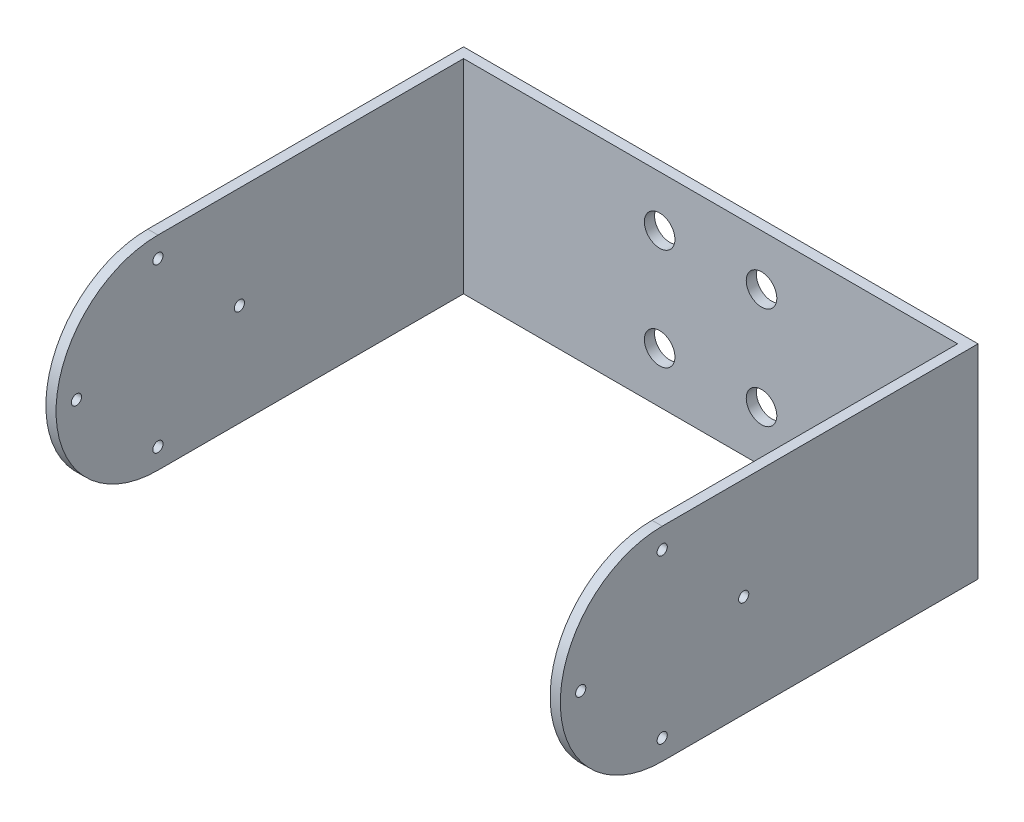
ISO-10303-21;
HEADER;
FILE_DESCRIPTION(('STEP AP214'),'2;1');
FILE_NAME('part.step','',(''),(''),'','','');
FILE_SCHEMA(('AUTOMOTIVE_DESIGN { 1 0 10303 214 1 1 1 1 }'));
ENDSEC;
DATA;
#1=APPLICATION_CONTEXT('core data for automotive mechanical design processes');
#2=APPLICATION_PROTOCOL_DEFINITION('international standard','automotive_design',2000,#1);
#3=PRODUCT_CONTEXT('',#1,'mechanical');
#4=PRODUCT('Part','Part','',(#3));
#5=PRODUCT_RELATED_PRODUCT_CATEGORY('part','',(#4));
#6=PRODUCT_DEFINITION_FORMATION('','',#4);
#7=PRODUCT_DEFINITION_CONTEXT('part definition',#1,'design');
#8=PRODUCT_DEFINITION('design','',#6,#7);
#9=PRODUCT_DEFINITION_SHAPE('','',#8);
#10=(LENGTH_UNIT() NAMED_UNIT(*) SI_UNIT(.MILLI.,.METRE.));
#11=(NAMED_UNIT(*) PLANE_ANGLE_UNIT() SI_UNIT($,.RADIAN.));
#12=(NAMED_UNIT(*) SI_UNIT($,.STERADIAN.) SOLID_ANGLE_UNIT());
#13=UNCERTAINTY_MEASURE_WITH_UNIT(LENGTH_MEASURE(1.E-05),#10,'distance_accuracy_value','');
#14=(GEOMETRIC_REPRESENTATION_CONTEXT(3) GLOBAL_UNCERTAINTY_ASSIGNED_CONTEXT((#13)) GLOBAL_UNIT_ASSIGNED_CONTEXT((#10,
#11,#12)) REPRESENTATION_CONTEXT('',''));
#15=CARTESIAN_POINT('',(0.,0.,0.));
#16=DIRECTION('',(0.,0.,1.));
#17=DIRECTION('',(1.,0.,0.));
#18=AXIS2_PLACEMENT_3D('',#15,#16,#17);
#19=CARTESIAN_POINT('',(-25.25,10.,1.));
#20=DIRECTION('',(1.,0.,0.));
#21=DIRECTION('',(0.,1.,0.));
#22=AXIS2_PLACEMENT_3D('',#19,#20,#21);
#23=PLANE('',#22);
#24=CARTESIAN_POINT('',(-25.25,8.00000000000001,31.));
#25=DIRECTION('',(1.,0.,0.));
#26=DIRECTION('',(0.,0.,-1.));
#27=AXIS2_PLACEMENT_3D('',#24,#25,#26);
#28=CIRCLE('',#27,0.5);
#29=CARTESIAN_POINT('',(-25.25,8.00000000000001,30.5));
#30=VERTEX_POINT('',#29);
#31=EDGE_CURVE('E162',#30,#30,#28,.T.);
#32=ORIENTED_EDGE('',*,*,#31,.T.);
#33=EDGE_LOOP('',(#32));
#34=FACE_BOUND('',#33,.T.);
#35=CARTESIAN_POINT('',(-25.25,0.,23.));
#36=DIRECTION('',(1.,0.,0.));
#37=DIRECTION('',(0.,0.,-1.));
#38=AXIS2_PLACEMENT_3D('',#35,#36,#37);
#39=CIRCLE('',#38,0.499999999999998);
#40=CARTESIAN_POINT('',(-25.25,0.,22.5));
#41=VERTEX_POINT('',#40);
#42=EDGE_CURVE('E258',#41,#41,#39,.T.);
#43=ORIENTED_EDGE('',*,*,#42,.T.);
#44=EDGE_LOOP('',(#43));
#45=FACE_BOUND('',#44,.T.);
#46=CARTESIAN_POINT('',(-25.25,-7.99999999999999,31.0000000000001));
#47=DIRECTION('',(1.,0.,0.));
#48=DIRECTION('',(0.,0.,-1.));
#49=AXIS2_PLACEMENT_3D('',#46,#47,#48);
#50=CIRCLE('',#49,0.499999999999996);
#51=CARTESIAN_POINT('',(-25.25,-7.99999999999999,30.5000000000001));
#52=VERTEX_POINT('',#51);
#53=EDGE_CURVE('E262',#52,#52,#50,.T.);
#54=ORIENTED_EDGE('',*,*,#53,.T.);
#55=EDGE_LOOP('',(#54));
#56=FACE_BOUND('',#55,.T.);
#57=CARTESIAN_POINT('',(-25.25,0.,39.));
#58=DIRECTION('',(1.,0.,0.));
#59=DIRECTION('',(0.,0.,-1.));
#60=AXIS2_PLACEMENT_3D('',#57,#58,#59);
#61=CIRCLE('',#60,0.499999999999999);
#62=CARTESIAN_POINT('',(-25.25,0.,38.5));
#63=VERTEX_POINT('',#62);
#64=EDGE_CURVE('E158',#63,#63,#61,.T.);
#65=ORIENTED_EDGE('',*,*,#64,.T.);
#66=EDGE_LOOP('',(#65));
#67=FACE_BOUND('',#66,.T.);
#68=CARTESIAN_POINT('',(-25.25,0.,31.));
#69=DIRECTION('',(-1.,0.,0.));
#70=DIRECTION('',(0.,-1.,0.));
#71=AXIS2_PLACEMENT_3D('',#68,#69,#70);
#72=CIRCLE('',#71,10.);
#73=CARTESIAN_POINT('',(-25.25,-10.,31.));
#74=VERTEX_POINT('',#73);
#75=CARTESIAN_POINT('',(-25.25,10.,31.));
#76=VERTEX_POINT('',#75);
#77=EDGE_CURVE('E119',#74,#76,#72,.T.);
#78=ORIENTED_EDGE('',*,*,#77,.T.);
#79=DIRECTION('',(0.,0.,-1.));
#80=VECTOR('',#79,1.);
#81=CARTESIAN_POINT('',(-25.25,10.,1.));
#82=LINE('',#81,#80);
#83=CARTESIAN_POINT('',(-25.25,10.,0.));
#84=VERTEX_POINT('',#83);
#85=EDGE_CURVE('E123',#76,#84,#82,.T.);
#86=ORIENTED_EDGE('',*,*,#85,.T.);
#87=DIRECTION('',(0.,-1.,0.));
#88=VECTOR('',#87,1.);
#89=CARTESIAN_POINT('',(-25.25,10.,0.));
#90=LINE('',#89,#88);
#91=CARTESIAN_POINT('',(-25.25,-10.,0.));
#92=VERTEX_POINT('',#91);
#93=EDGE_CURVE('E206',#84,#92,#90,.T.);
#94=ORIENTED_EDGE('',*,*,#93,.T.);
#95=DIRECTION('',(0.,0.,-1.));
#96=VECTOR('',#95,1.);
#97=CARTESIAN_POINT('',(-25.25,-10.,1.));
#98=LINE('',#97,#96);
#99=EDGE_CURVE('E12',#74,#92,#98,.T.);
#100=ORIENTED_EDGE('',*,*,#99,.F.);
#101=EDGE_LOOP('',(#78,#86,#94,#100));
#102=FACE_BOUND('',#101,.T.);
#103=ADVANCED_FACE('F52',(#34,#45,#56,#67,#102),#23,.F.);
#104=CARTESIAN_POINT('',(25.25,10.,1.));
#105=DIRECTION('',(-1.,0.,0.));
#106=DIRECTION('',(0.,-1.,0.));
#107=AXIS2_PLACEMENT_3D('',#104,#105,#106);
#108=PLANE('',#107);
#109=CARTESIAN_POINT('',(25.25,8.00000000000001,31.));
#110=DIRECTION('',(1.,0.,0.));
#111=DIRECTION('',(0.,0.,-1.));
#112=AXIS2_PLACEMENT_3D('',#109,#110,#111);
#113=CIRCLE('',#112,0.5);
#114=CARTESIAN_POINT('',(25.25,8.00000000000001,30.5));
#115=VERTEX_POINT('',#114);
#116=EDGE_CURVE('E502',#115,#115,#113,.T.);
#117=ORIENTED_EDGE('',*,*,#116,.F.);
#118=EDGE_LOOP('',(#117));
#119=FACE_BOUND('',#118,.T.);
#120=CARTESIAN_POINT('',(25.25,0.,23.));
#121=DIRECTION('',(1.,0.,0.));
#122=DIRECTION('',(0.,0.,-1.));
#123=AXIS2_PLACEMENT_3D('',#120,#121,#122);
#124=CIRCLE('',#123,0.499999999999998);
#125=CARTESIAN_POINT('',(25.25,0.,22.5));
#126=VERTEX_POINT('',#125);
#127=EDGE_CURVE('E488',#126,#126,#124,.T.);
#128=ORIENTED_EDGE('',*,*,#127,.F.);
#129=EDGE_LOOP('',(#128));
#130=FACE_BOUND('',#129,.T.);
#131=CARTESIAN_POINT('',(25.25,-7.99999999999999,31.0000000000001));
#132=DIRECTION('',(1.,0.,0.));
#133=DIRECTION('',(0.,0.,-1.));
#134=AXIS2_PLACEMENT_3D('',#131,#132,#133);
#135=CIRCLE('',#134,0.499999999999996);
#136=CARTESIAN_POINT('',(25.25,-7.99999999999999,30.5000000000001));
#137=VERTEX_POINT('',#136);
#138=EDGE_CURVE('E175',#137,#137,#135,.T.);
#139=ORIENTED_EDGE('',*,*,#138,.F.);
#140=EDGE_LOOP('',(#139));
#141=FACE_BOUND('',#140,.T.);
#142=CARTESIAN_POINT('',(25.25,0.,39.));
#143=DIRECTION('',(1.,0.,0.));
#144=DIRECTION('',(0.,0.,-1.));
#145=AXIS2_PLACEMENT_3D('',#142,#143,#144);
#146=CIRCLE('',#145,0.499999999999999);
#147=CARTESIAN_POINT('',(25.25,0.,38.5));
#148=VERTEX_POINT('',#147);
#149=EDGE_CURVE('E181',#148,#148,#146,.T.);
#150=ORIENTED_EDGE('',*,*,#149,.F.);
#151=EDGE_LOOP('',(#150));
#152=FACE_BOUND('',#151,.T.);
#153=DIRECTION('',(0.,0.,-1.));
#154=VECTOR('',#153,1.);
#155=CARTESIAN_POINT('',(25.25,10.,1.));
#156=LINE('',#155,#154);
#157=CARTESIAN_POINT('',(25.25,10.,31.));
#158=VERTEX_POINT('',#157);
#159=CARTESIAN_POINT('',(25.25,10.,0.));
#160=VERTEX_POINT('',#159);
#161=EDGE_CURVE('E144',#158,#160,#156,.T.);
#162=ORIENTED_EDGE('',*,*,#161,.F.);
#163=CARTESIAN_POINT('',(25.25,0.,31.));
#164=DIRECTION('',(-1.,0.,0.));
#165=DIRECTION('',(0.,-1.,0.));
#166=AXIS2_PLACEMENT_3D('',#163,#164,#165);
#167=CIRCLE('',#166,10.);
#168=CARTESIAN_POINT('',(25.25,-9.99999999999999,31.));
#169=VERTEX_POINT('',#168);
#170=EDGE_CURVE('E193',#169,#158,#167,.T.);
#171=ORIENTED_EDGE('',*,*,#170,.F.);
#172=DIRECTION('',(0.,0.,-1.));
#173=VECTOR('',#172,1.);
#174=CARTESIAN_POINT('',(25.25,-10.,1.));
#175=LINE('',#174,#173);
#176=CARTESIAN_POINT('',(25.25,-10.,0.));
#177=VERTEX_POINT('',#176);
#178=EDGE_CURVE('E60',#169,#177,#175,.T.);
#179=ORIENTED_EDGE('',*,*,#178,.T.);
#180=DIRECTION('',(0.,1.,0.));
#181=VECTOR('',#180,1.);
#182=CARTESIAN_POINT('',(25.25,10.,0.));
#183=LINE('',#182,#181);
#184=EDGE_CURVE('E211',#177,#160,#183,.T.);
#185=ORIENTED_EDGE('',*,*,#184,.T.);
#186=EDGE_LOOP('',(#162,#171,#179,#185));
#187=FACE_BOUND('',#186,.T.);
#188=ADVANCED_FACE('F216',(#119,#130,#141,#152,#187),#108,.F.);
#189=CARTESIAN_POINT('',(-24.25,10.,41.));
#190=DIRECTION('',(-1.,0.,0.));
#191=DIRECTION('',(0.,-1.,0.));
#192=AXIS2_PLACEMENT_3D('',#189,#190,#191);
#193=PLANE('',#192);
#194=CARTESIAN_POINT('',(-24.25,8.00000000000001,31.));
#195=DIRECTION('',(-1.,0.,0.));
#196=DIRECTION('',(0.,-1.,0.));
#197=AXIS2_PLACEMENT_3D('',#194,#195,#196);
#198=CIRCLE('',#197,0.5);
#199=CARTESIAN_POINT('',(-24.25,7.50000000000001,31.));
#200=VERTEX_POINT('',#199);
#201=EDGE_CURVE('E178',#200,#200,#198,.T.);
#202=ORIENTED_EDGE('',*,*,#201,.T.);
#203=EDGE_LOOP('',(#202));
#204=FACE_BOUND('',#203,.T.);
#205=CARTESIAN_POINT('',(-24.25,0.,23.));
#206=DIRECTION('',(-1.,0.,0.));
#207=DIRECTION('',(0.,-1.,0.));
#208=AXIS2_PLACEMENT_3D('',#205,#206,#207);
#209=CIRCLE('',#208,0.499999999999998);
#210=CARTESIAN_POINT('',(-24.25,-0.500000000000034,23.));
#211=VERTEX_POINT('',#210);
#212=EDGE_CURVE('E165',#211,#211,#209,.T.);
#213=ORIENTED_EDGE('',*,*,#212,.T.);
#214=EDGE_LOOP('',(#213));
#215=FACE_BOUND('',#214,.T.);
#216=CARTESIAN_POINT('',(-24.25,-7.99999999999999,31.0000000000001));
#217=DIRECTION('',(-1.,0.,0.));
#218=DIRECTION('',(0.,-1.,0.));
#219=AXIS2_PLACEMENT_3D('',#216,#217,#218);
#220=CIRCLE('',#219,0.499999999999996);
#221=CARTESIAN_POINT('',(-24.25,-8.49999999999999,31.0000000000001));
#222=VERTEX_POINT('',#221);
#223=EDGE_CURVE('E161',#222,#222,#220,.T.);
#224=ORIENTED_EDGE('',*,*,#223,.T.);
#225=EDGE_LOOP('',(#224));
#226=FACE_BOUND('',#225,.T.);
#227=CARTESIAN_POINT('',(-24.25,0.,39.));
#228=DIRECTION('',(-1.,0.,0.));
#229=DIRECTION('',(0.,-1.,0.));
#230=AXIS2_PLACEMENT_3D('',#227,#228,#229);
#231=CIRCLE('',#230,0.499999999999999);
#232=CARTESIAN_POINT('',(-24.25,-0.499999999999995,39.));
#233=VERTEX_POINT('',#232);
#234=EDGE_CURVE('E137',#233,#233,#231,.T.);
#235=ORIENTED_EDGE('',*,*,#234,.T.);
#236=EDGE_LOOP('',(#235));
#237=FACE_BOUND('',#236,.T.);
#238=DIRECTION('',(0.,0.,-1.));
#239=VECTOR('',#238,1.);
#240=CARTESIAN_POINT('',(-24.25,10.,41.));
#241=LINE('',#240,#239);
#242=CARTESIAN_POINT('',(-24.25,10.,31.));
#243=VERTEX_POINT('',#242);
#244=CARTESIAN_POINT('',(-24.25,10.,1.));
#245=VERTEX_POINT('',#244);
#246=EDGE_CURVE('E202',#243,#245,#241,.T.);
#247=ORIENTED_EDGE('',*,*,#246,.F.);
#248=CARTESIAN_POINT('',(-24.25,0.,31.));
#249=DIRECTION('',(-1.,0.,0.));
#250=DIRECTION('',(0.,-1.,0.));
#251=AXIS2_PLACEMENT_3D('',#248,#249,#250);
#252=CIRCLE('',#251,10.);
#253=CARTESIAN_POINT('',(-24.25,-10.,31.));
#254=VERTEX_POINT('',#253);
#255=EDGE_CURVE('E134',#254,#243,#252,.T.);
#256=ORIENTED_EDGE('',*,*,#255,.F.);
#257=DIRECTION('',(0.,0.,-1.));
#258=VECTOR('',#257,1.);
#259=CARTESIAN_POINT('',(-24.25,-10.,41.));
#260=LINE('',#259,#258);
#261=CARTESIAN_POINT('',(-24.25,-10.,1.));
#262=VERTEX_POINT('',#261);
#263=EDGE_CURVE('E204',#254,#262,#260,.T.);
#264=ORIENTED_EDGE('',*,*,#263,.T.);
#265=DIRECTION('',(0.,1.,0.));
#266=VECTOR('',#265,1.);
#267=CARTESIAN_POINT('',(-24.25,10.,1.));
#268=LINE('',#267,#266);
#269=EDGE_CURVE('E199',#262,#245,#268,.T.);
#270=ORIENTED_EDGE('',*,*,#269,.T.);
#271=EDGE_LOOP('',(#247,#256,#264,#270));
#272=FACE_BOUND('',#271,.T.);
#273=ADVANCED_FACE('F225',(#204,#215,#226,#237,#272),#193,.F.);
#274=CARTESIAN_POINT('',(24.25,10.,41.));
#275=DIRECTION('',(1.,0.,0.));
#276=DIRECTION('',(0.,1.,0.));
#277=AXIS2_PLACEMENT_3D('',#274,#275,#276);
#278=PLANE('',#277);
#279=CARTESIAN_POINT('',(24.25,8.00000000000001,31.));
#280=DIRECTION('',(1.,0.,0.));
#281=DIRECTION('',(0.,1.,0.));
#282=AXIS2_PLACEMENT_3D('',#279,#280,#281);
#283=CIRCLE('',#282,0.5);
#284=CARTESIAN_POINT('',(24.25,8.50000000000001,31.));
#285=VERTEX_POINT('',#284);
#286=EDGE_CURVE('E55',#285,#285,#283,.T.);
#287=ORIENTED_EDGE('',*,*,#286,.T.);
#288=EDGE_LOOP('',(#287));
#289=FACE_BOUND('',#288,.T.);
#290=CARTESIAN_POINT('',(24.25,0.,23.));
#291=DIRECTION('',(1.,0.,0.));
#292=DIRECTION('',(0.,1.,0.));
#293=AXIS2_PLACEMENT_3D('',#290,#291,#292);
#294=CIRCLE('',#293,0.499999999999998);
#295=CARTESIAN_POINT('',(24.25,0.499999999999962,23.));
#296=VERTEX_POINT('',#295);
#297=EDGE_CURVE('E163',#296,#296,#294,.T.);
#298=ORIENTED_EDGE('',*,*,#297,.T.);
#299=EDGE_LOOP('',(#298));
#300=FACE_BOUND('',#299,.T.);
#301=CARTESIAN_POINT('',(24.25,-7.99999999999999,31.0000000000001));
#302=DIRECTION('',(1.,0.,0.));
#303=DIRECTION('',(0.,1.,0.));
#304=AXIS2_PLACEMENT_3D('',#301,#302,#303);
#305=CIRCLE('',#304,0.499999999999996);
#306=CARTESIAN_POINT('',(24.25,-7.49999999999999,31.0000000000001));
#307=VERTEX_POINT('',#306);
#308=EDGE_CURVE('E159',#307,#307,#305,.T.);
#309=ORIENTED_EDGE('',*,*,#308,.T.);
#310=EDGE_LOOP('',(#309));
#311=FACE_BOUND('',#310,.T.);
#312=CARTESIAN_POINT('',(24.25,0.,39.));
#313=DIRECTION('',(1.,0.,0.));
#314=DIRECTION('',(0.,1.,0.));
#315=AXIS2_PLACEMENT_3D('',#312,#313,#314);
#316=CIRCLE('',#315,0.499999999999999);
#317=CARTESIAN_POINT('',(24.25,0.500000000000003,39.));
#318=VERTEX_POINT('',#317);
#319=EDGE_CURVE('E155',#318,#318,#316,.T.);
#320=ORIENTED_EDGE('',*,*,#319,.T.);
#321=EDGE_LOOP('',(#320));
#322=FACE_BOUND('',#321,.T.);
#323=CARTESIAN_POINT('',(24.25,0.,31.));
#324=DIRECTION('',(1.,0.,0.));
#325=DIRECTION('',(0.,1.,0.));
#326=AXIS2_PLACEMENT_3D('',#323,#324,#325);
#327=CIRCLE('',#326,10.);
#328=CARTESIAN_POINT('',(24.25,10.,31.));
#329=VERTEX_POINT('',#328);
#330=CARTESIAN_POINT('',(24.25,-9.99999999999999,31.));
#331=VERTEX_POINT('',#330);
#332=EDGE_CURVE('E190',#329,#331,#327,.T.);
#333=ORIENTED_EDGE('',*,*,#332,.F.);
#334=DIRECTION('',(0.,0.,-1.));
#335=VECTOR('',#334,1.);
#336=CARTESIAN_POINT('',(24.25,10.,41.));
#337=LINE('',#336,#335);
#338=CARTESIAN_POINT('',(24.25,10.,1.));
#339=VERTEX_POINT('',#338);
#340=EDGE_CURVE('E68',#329,#339,#337,.T.);
#341=ORIENTED_EDGE('',*,*,#340,.T.);
#342=DIRECTION('',(0.,-1.,0.));
#343=VECTOR('',#342,1.);
#344=CARTESIAN_POINT('',(24.25,10.,1.));
#345=LINE('',#344,#343);
#346=CARTESIAN_POINT('',(24.25,-10.,1.));
#347=VERTEX_POINT('',#346);
#348=EDGE_CURVE('E195',#339,#347,#345,.T.);
#349=ORIENTED_EDGE('',*,*,#348,.T.);
#350=DIRECTION('',(0.,0.,-1.));
#351=VECTOR('',#350,1.);
#352=CARTESIAN_POINT('',(24.25,-10.,41.));
#353=LINE('',#352,#351);
#354=EDGE_CURVE('E76',#331,#347,#353,.T.);
#355=ORIENTED_EDGE('',*,*,#354,.F.);
#356=EDGE_LOOP('',(#333,#341,#349,#355));
#357=FACE_BOUND('',#356,.T.);
#358=ADVANCED_FACE('F230',(#289,#300,#311,#322,#357),#278,.F.);
#359=CARTESIAN_POINT('',(-25.25,10.,1.));
#360=DIRECTION('',(0.,-1.,0.));
#361=DIRECTION('',(0.,0.,-1.));
#362=AXIS2_PLACEMENT_3D('',#359,#360,#361);
#363=PLANE('',#362);
#364=DIRECTION('',(-1.,0.,0.));
#365=VECTOR('',#364,1.);
#366=CARTESIAN_POINT('',(74.75,10.,31.));
#367=LINE('',#366,#365);
#368=EDGE_CURVE('E128',#158,#329,#367,.T.);
#369=ORIENTED_EDGE('',*,*,#368,.F.);
#370=ORIENTED_EDGE('',*,*,#161,.T.);
#371=DIRECTION('',(-1.,0.,0.));
#372=VECTOR('',#371,1.);
#373=CARTESIAN_POINT('',(-25.25,10.,0.));
#374=LINE('',#373,#372);
#375=EDGE_CURVE('E142',#160,#84,#374,.T.);
#376=ORIENTED_EDGE('',*,*,#375,.T.);
#377=ORIENTED_EDGE('',*,*,#85,.F.);
#378=EDGE_CURVE('E131',#243,#76,#367,.T.);
#379=ORIENTED_EDGE('',*,*,#378,.F.);
#380=ORIENTED_EDGE('',*,*,#246,.T.);
#381=DIRECTION('',(-1.,0.,0.));
#382=VECTOR('',#381,1.);
#383=CARTESIAN_POINT('',(-25.25,10.,1.));
#384=LINE('',#383,#382);
#385=EDGE_CURVE('E145',#339,#245,#384,.T.);
#386=ORIENTED_EDGE('',*,*,#385,.F.);
#387=ORIENTED_EDGE('',*,*,#340,.F.);
#388=EDGE_LOOP('',(#369,#370,#376,#377,#379,#380,#386,#387));
#389=FACE_BOUND('',#388,.T.);
#390=ADVANCED_FACE('F140',(#389),#363,.F.);
#391=CARTESIAN_POINT('',(0.,0.,1.));
#392=DIRECTION('',(0.,0.,1.));
#393=DIRECTION('',(1.,0.,0.));
#394=AXIS2_PLACEMENT_3D('',#391,#392,#393);
#395=PLANE('',#394);
#396=CARTESIAN_POINT('',(5.,-5.,1.));
#397=DIRECTION('',(0.,0.,1.));
#398=DIRECTION('',(1.,0.,0.));
#399=AXIS2_PLACEMENT_3D('',#396,#397,#398);
#400=CIRCLE('',#399,1.5);
#401=CARTESIAN_POINT('',(3.5,-5.,1.));
#402=VERTEX_POINT('',#401);
#403=EDGE_CURVE('E524',#402,#402,#400,.F.);
#404=ORIENTED_EDGE('',*,*,#403,.T.);
#405=EDGE_LOOP('',(#404));
#406=FACE_BOUND('',#405,.T.);
#407=CARTESIAN_POINT('',(-5.,5.,1.));
#408=DIRECTION('',(0.,0.,1.));
#409=DIRECTION('',(1.,0.,0.));
#410=AXIS2_PLACEMENT_3D('',#407,#408,#409);
#411=CIRCLE('',#410,1.5);
#412=CARTESIAN_POINT('',(-6.5,5.,1.));
#413=VERTEX_POINT('',#412);
#414=EDGE_CURVE('E518',#413,#413,#411,.F.);
#415=ORIENTED_EDGE('',*,*,#414,.T.);
#416=EDGE_LOOP('',(#415));
#417=FACE_BOUND('',#416,.T.);
#418=CARTESIAN_POINT('',(-5.,-5.,1.));
#419=DIRECTION('',(0.,0.,1.));
#420=DIRECTION('',(1.,0.,0.));
#421=AXIS2_PLACEMENT_3D('',#418,#419,#420);
#422=CIRCLE('',#421,1.5);
#423=CARTESIAN_POINT('',(-6.5,-5.,1.));
#424=VERTEX_POINT('',#423);
#425=EDGE_CURVE('E498',#424,#424,#422,.F.);
#426=ORIENTED_EDGE('',*,*,#425,.T.);
#427=EDGE_LOOP('',(#426));
#428=FACE_BOUND('',#427,.T.);
#429=CARTESIAN_POINT('',(5.,5.,1.));
#430=DIRECTION('',(0.,0.,1.));
#431=DIRECTION('',(1.,0.,0.));
#432=AXIS2_PLACEMENT_3D('',#429,#430,#431);
#433=CIRCLE('',#432,1.5);
#434=CARTESIAN_POINT('',(3.5,5.,1.));
#435=VERTEX_POINT('',#434);
#436=EDGE_CURVE('E490',#435,#435,#433,.F.);
#437=ORIENTED_EDGE('',*,*,#436,.T.);
#438=EDGE_LOOP('',(#437));
#439=FACE_BOUND('',#438,.T.);
#440=DIRECTION('',(1.,0.,0.));
#441=VECTOR('',#440,1.);
#442=CARTESIAN_POINT('',(-25.25,-10.,1.));
#443=LINE('',#442,#441);
#444=EDGE_CURVE('E149',#262,#347,#443,.T.);
#445=ORIENTED_EDGE('',*,*,#444,.T.);
#446=ORIENTED_EDGE('',*,*,#348,.F.);
#447=ORIENTED_EDGE('',*,*,#385,.T.);
#448=ORIENTED_EDGE('',*,*,#269,.F.);
#449=EDGE_LOOP('',(#445,#446,#447,#448));
#450=FACE_BOUND('',#449,.T.);
#451=ADVANCED_FACE('F229',(#406,#417,#428,#439,#450),#395,.T.);
#452=CARTESIAN_POINT('',(-25.25,-10.,1.));
#453=DIRECTION('',(0.,1.,0.));
#454=DIRECTION('',(0.,0.,1.));
#455=AXIS2_PLACEMENT_3D('',#452,#453,#454);
#456=PLANE('',#455);
#457=ORIENTED_EDGE('',*,*,#178,.F.);
#458=DIRECTION('',(-1.,0.,0.));
#459=VECTOR('',#458,1.);
#460=CARTESIAN_POINT('',(74.75,-9.99999999999998,31.));
#461=LINE('',#460,#459);
#462=EDGE_CURVE('E189',#169,#331,#461,.T.);
#463=ORIENTED_EDGE('',*,*,#462,.T.);
#464=ORIENTED_EDGE('',*,*,#354,.T.);
#465=ORIENTED_EDGE('',*,*,#444,.F.);
#466=ORIENTED_EDGE('',*,*,#263,.F.);
#467=EDGE_CURVE('E127',#254,#74,#461,.T.);
#468=ORIENTED_EDGE('',*,*,#467,.T.);
#469=ORIENTED_EDGE('',*,*,#99,.T.);
#470=DIRECTION('',(1.,0.,0.));
#471=VECTOR('',#470,1.);
#472=CARTESIAN_POINT('',(-25.25,-10.,0.));
#473=LINE('',#472,#471);
#474=EDGE_CURVE('E209',#92,#177,#473,.T.);
#475=ORIENTED_EDGE('',*,*,#474,.T.);
#476=EDGE_LOOP('',(#457,#463,#464,#465,#466,#468,#469,#475));
#477=FACE_BOUND('',#476,.T.);
#478=ADVANCED_FACE('F222',(#477),#456,.F.);
#479=CARTESIAN_POINT('',(0.,0.,0.));
#480=DIRECTION('',(0.,0.,1.));
#481=DIRECTION('',(1.,0.,0.));
#482=AXIS2_PLACEMENT_3D('',#479,#480,#481);
#483=PLANE('',#482);
#484=CARTESIAN_POINT('',(5.,-5.,0.));
#485=DIRECTION('',(0.,0.,-1.));
#486=DIRECTION('',(-1.,0.,0.));
#487=AXIS2_PLACEMENT_3D('',#484,#485,#486);
#488=CIRCLE('',#487,1.5);
#489=CARTESIAN_POINT('',(3.5,-5.,0.));
#490=VERTEX_POINT('',#489);
#491=EDGE_CURVE('E495',#490,#490,#488,.T.);
#492=ORIENTED_EDGE('',*,*,#491,.F.);
#493=EDGE_LOOP('',(#492));
#494=FACE_BOUND('',#493,.T.);
#495=CARTESIAN_POINT('',(-5.,5.,0.));
#496=DIRECTION('',(0.,0.,-1.));
#497=DIRECTION('',(-1.,0.,0.));
#498=AXIS2_PLACEMENT_3D('',#495,#496,#497);
#499=CIRCLE('',#498,1.5);
#500=CARTESIAN_POINT('',(-6.5,5.,0.));
#501=VERTEX_POINT('',#500);
#502=EDGE_CURVE('E521',#501,#501,#499,.T.);
#503=ORIENTED_EDGE('',*,*,#502,.F.);
#504=EDGE_LOOP('',(#503));
#505=FACE_BOUND('',#504,.T.);
#506=CARTESIAN_POINT('',(-5.,-5.,0.));
#507=DIRECTION('',(0.,0.,-1.));
#508=DIRECTION('',(-1.,0.,0.));
#509=AXIS2_PLACEMENT_3D('',#506,#507,#508);
#510=CIRCLE('',#509,1.5);
#511=CARTESIAN_POINT('',(-6.5,-5.,0.));
#512=VERTEX_POINT('',#511);
#513=EDGE_CURVE('E515',#512,#512,#510,.T.);
#514=ORIENTED_EDGE('',*,*,#513,.F.);
#515=EDGE_LOOP('',(#514));
#516=FACE_BOUND('',#515,.T.);
#517=CARTESIAN_POINT('',(5.,5.,0.));
#518=DIRECTION('',(0.,0.,-1.));
#519=DIRECTION('',(-1.,0.,0.));
#520=AXIS2_PLACEMENT_3D('',#517,#518,#519);
#521=CIRCLE('',#520,1.5);
#522=CARTESIAN_POINT('',(3.5,5.,0.));
#523=VERTEX_POINT('',#522);
#524=EDGE_CURVE('E487',#523,#523,#521,.T.);
#525=ORIENTED_EDGE('',*,*,#524,.F.);
#526=EDGE_LOOP('',(#525));
#527=FACE_BOUND('',#526,.T.);
#528=ORIENTED_EDGE('',*,*,#93,.F.);
#529=ORIENTED_EDGE('',*,*,#375,.F.);
#530=ORIENTED_EDGE('',*,*,#184,.F.);
#531=ORIENTED_EDGE('',*,*,#474,.F.);
#532=EDGE_LOOP('',(#528,#529,#530,#531));
#533=FACE_BOUND('',#532,.T.);
#534=ADVANCED_FACE('F221',(#494,#505,#516,#527,#533),#483,.F.);
#535=CARTESIAN_POINT('',(74.75,0.,31.));
#536=DIRECTION('',(-1.,0.,0.));
#537=DIRECTION('',(0.,-1.,0.));
#538=AXIS2_PLACEMENT_3D('',#535,#536,#537);
#539=CYLINDRICAL_SURFACE('',#538,10.);
#540=ORIENTED_EDGE('',*,*,#170,.T.);
#541=ORIENTED_EDGE('',*,*,#368,.T.);
#542=ORIENTED_EDGE('',*,*,#332,.T.);
#543=ORIENTED_EDGE('',*,*,#462,.F.);
#544=EDGE_LOOP('',(#540,#541,#542,#543));
#545=FACE_BOUND('',#544,.T.);
#546=ADVANCED_FACE('F233',(#545),#539,.T.);
#547=ORIENTED_EDGE('',*,*,#255,.T.);
#548=ORIENTED_EDGE('',*,*,#378,.T.);
#549=ORIENTED_EDGE('',*,*,#77,.F.);
#550=ORIENTED_EDGE('',*,*,#467,.F.);
#551=EDGE_LOOP('',(#547,#548,#549,#550));
#552=FACE_BOUND('',#551,.T.);
#553=ADVANCED_FACE('F132',(#552),#539,.T.);
#554=CARTESIAN_POINT('',(-25.25,0.,39.));
#555=DIRECTION('',(1.,0.,0.));
#556=DIRECTION('',(0.,0.,-1.));
#557=AXIS2_PLACEMENT_3D('',#554,#555,#556);
#558=CYLINDRICAL_SURFACE('',#557,0.499999999999999);
#559=ORIENTED_EDGE('',*,*,#149,.T.);
#560=EDGE_LOOP('',(#559));
#561=FACE_BOUND('',#560,.T.);
#562=ORIENTED_EDGE('',*,*,#319,.F.);
#563=EDGE_LOOP('',(#562));
#564=FACE_BOUND('',#563,.T.);
#565=ADVANCED_FACE('F240',(#561,#564),#558,.F.);
#566=ORIENTED_EDGE('',*,*,#64,.F.);
#567=EDGE_LOOP('',(#566));
#568=FACE_BOUND('',#567,.T.);
#569=ORIENTED_EDGE('',*,*,#234,.F.);
#570=EDGE_LOOP('',(#569));
#571=FACE_BOUND('',#570,.T.);
#572=ADVANCED_FACE('F265',(#568,#571),#558,.F.);
#573=CARTESIAN_POINT('',(-25.25,-7.99999999999999,31.0000000000001));
#574=DIRECTION('',(1.,0.,0.));
#575=DIRECTION('',(0.,0.,-1.));
#576=AXIS2_PLACEMENT_3D('',#573,#574,#575);
#577=CYLINDRICAL_SURFACE('',#576,0.499999999999996);
#578=ORIENTED_EDGE('',*,*,#138,.T.);
#579=EDGE_LOOP('',(#578));
#580=FACE_BOUND('',#579,.T.);
#581=ORIENTED_EDGE('',*,*,#308,.F.);
#582=EDGE_LOOP('',(#581));
#583=FACE_BOUND('',#582,.T.);
#584=ADVANCED_FACE('F268',(#580,#583),#577,.F.);
#585=CARTESIAN_POINT('',(-25.25,0.,23.));
#586=DIRECTION('',(1.,0.,0.));
#587=DIRECTION('',(0.,0.,-1.));
#588=AXIS2_PLACEMENT_3D('',#585,#586,#587);
#589=CYLINDRICAL_SURFACE('',#588,0.499999999999998);
#590=ORIENTED_EDGE('',*,*,#127,.T.);
#591=EDGE_LOOP('',(#590));
#592=FACE_BOUND('',#591,.T.);
#593=ORIENTED_EDGE('',*,*,#297,.F.);
#594=EDGE_LOOP('',(#593));
#595=FACE_BOUND('',#594,.T.);
#596=ADVANCED_FACE('F356',(#592,#595),#589,.F.);
#597=CARTESIAN_POINT('',(-25.25,8.00000000000001,31.));
#598=DIRECTION('',(1.,0.,0.));
#599=DIRECTION('',(0.,0.,-1.));
#600=AXIS2_PLACEMENT_3D('',#597,#598,#599);
#601=CYLINDRICAL_SURFACE('',#600,0.5);
#602=ORIENTED_EDGE('',*,*,#116,.T.);
#603=EDGE_LOOP('',(#602));
#604=FACE_BOUND('',#603,.T.);
#605=ORIENTED_EDGE('',*,*,#286,.F.);
#606=EDGE_LOOP('',(#605));
#607=FACE_BOUND('',#606,.T.);
#608=ADVANCED_FACE('F351',(#604,#607),#601,.F.);
#609=ORIENTED_EDGE('',*,*,#53,.F.);
#610=EDGE_LOOP('',(#609));
#611=FACE_BOUND('',#610,.T.);
#612=ORIENTED_EDGE('',*,*,#223,.F.);
#613=EDGE_LOOP('',(#612));
#614=FACE_BOUND('',#613,.T.);
#615=ADVANCED_FACE('F354',(#611,#614),#577,.F.);
#616=ORIENTED_EDGE('',*,*,#42,.F.);
#617=EDGE_LOOP('',(#616));
#618=FACE_BOUND('',#617,.T.);
#619=ORIENTED_EDGE('',*,*,#212,.F.);
#620=EDGE_LOOP('',(#619));
#621=FACE_BOUND('',#620,.T.);
#622=ADVANCED_FACE('F349',(#618,#621),#589,.F.);
#623=ORIENTED_EDGE('',*,*,#31,.F.);
#624=EDGE_LOOP('',(#623));
#625=FACE_BOUND('',#624,.T.);
#626=ORIENTED_EDGE('',*,*,#201,.F.);
#627=EDGE_LOOP('',(#626));
#628=FACE_BOUND('',#627,.T.);
#629=ADVANCED_FACE('F309',(#625,#628),#601,.F.);
#630=CARTESIAN_POINT('',(5.,5.,41.001));
#631=DIRECTION('',(0.,0.,-1.));
#632=DIRECTION('',(-1.,0.,0.));
#633=AXIS2_PLACEMENT_3D('',#630,#631,#632);
#634=CYLINDRICAL_SURFACE('',#633,1.5);
#635=CARTESIAN_POINT('',(3.5,5.,1.));
#636=CARTESIAN_POINT('',(3.5,5.,0.989583333333335));
#637=CARTESIAN_POINT('',(3.5,5.,0.97916666666667));
#638=CARTESIAN_POINT('',(3.5,5.,0.958333333333336));
#639=CARTESIAN_POINT('',(3.5,5.,0.947916666666669));
#640=CARTESIAN_POINT('',(3.5,5.,0.927083333333333));
#641=CARTESIAN_POINT('',(3.5,5.,0.916666666666665));
#642=CARTESIAN_POINT('',(3.5,5.,0.895833333333332));
#643=CARTESIAN_POINT('',(3.5,5.,0.885416666666666));
#644=CARTESIAN_POINT('',(3.5,5.,0.864583333333335));
#645=CARTESIAN_POINT('',(3.5,5.,0.85416666666667));
#646=CARTESIAN_POINT('',(3.5,5.,0.833333333333336));
#647=CARTESIAN_POINT('',(3.5,5.,0.822916666666669));
#648=CARTESIAN_POINT('',(3.5,5.,0.802083333333333));
#649=CARTESIAN_POINT('',(3.5,5.,0.791666666666665));
#650=CARTESIAN_POINT('',(3.5,5.,0.770833333333332));
#651=CARTESIAN_POINT('',(3.5,5.,0.760416666666666));
#652=CARTESIAN_POINT('',(3.5,5.,0.739583333333335));
#653=CARTESIAN_POINT('',(3.5,5.,0.72916666666667));
#654=CARTESIAN_POINT('',(3.5,5.,0.708333333333336));
#655=CARTESIAN_POINT('',(3.5,5.,0.697916666666668));
#656=CARTESIAN_POINT('',(3.5,5.,0.677083333333333));
#657=CARTESIAN_POINT('',(3.5,5.,0.666666666666665));
#658=CARTESIAN_POINT('',(3.5,5.,0.645833333333332));
#659=CARTESIAN_POINT('',(3.5,5.,0.635416666666666));
#660=CARTESIAN_POINT('',(3.5,5.,0.614583333333335));
#661=CARTESIAN_POINT('',(3.5,5.,0.60416666666667));
#662=CARTESIAN_POINT('',(3.5,5.,0.583333333333336));
#663=CARTESIAN_POINT('',(3.5,5.,0.572916666666668));
#664=CARTESIAN_POINT('',(3.5,5.,0.552083333333333));
#665=CARTESIAN_POINT('',(3.5,5.,0.541666666666665));
#666=CARTESIAN_POINT('',(3.5,5.,0.520833333333331));
#667=CARTESIAN_POINT('',(3.5,5.,0.510416666666666));
#668=CARTESIAN_POINT('',(3.5,5.,0.489583333333335));
#669=CARTESIAN_POINT('',(3.5,5.,0.479166666666669));
#670=CARTESIAN_POINT('',(3.5,5.,0.458333333333336));
#671=CARTESIAN_POINT('',(3.5,5.,0.447916666666668));
#672=CARTESIAN_POINT('',(3.5,5.,0.427083333333333));
#673=CARTESIAN_POINT('',(3.5,5.,0.416666666666665));
#674=CARTESIAN_POINT('',(3.5,5.,0.395833333333331));
#675=CARTESIAN_POINT('',(3.5,5.,0.385416666666666));
#676=CARTESIAN_POINT('',(3.5,5.,0.364583333333335));
#677=CARTESIAN_POINT('',(3.5,5.,0.354166666666669));
#678=CARTESIAN_POINT('',(3.5,5.,0.333333333333336));
#679=CARTESIAN_POINT('',(3.5,5.,0.322916666666668));
#680=CARTESIAN_POINT('',(3.5,5.,0.302083333333332));
#681=CARTESIAN_POINT('',(3.5,5.,0.291666666666665));
#682=CARTESIAN_POINT('',(3.5,5.,0.270833333333331));
#683=CARTESIAN_POINT('',(3.5,5.,0.260416666666666));
#684=CARTESIAN_POINT('',(3.5,5.,0.239583333333335));
#685=CARTESIAN_POINT('',(3.5,5.,0.229166666666669));
#686=CARTESIAN_POINT('',(3.5,5.,0.208333333333336));
#687=CARTESIAN_POINT('',(3.5,5.,0.197916666666668));
#688=CARTESIAN_POINT('',(3.5,5.,0.177083333333332));
#689=CARTESIAN_POINT('',(3.5,5.,0.166666666666664));
#690=CARTESIAN_POINT('',(3.5,5.,0.145833333333331));
#691=CARTESIAN_POINT('',(3.5,5.,0.135416666666666));
#692=CARTESIAN_POINT('',(3.5,5.,0.114583333333335));
#693=CARTESIAN_POINT('',(3.5,5.,0.104166666666669));
#694=CARTESIAN_POINT('',(3.5,5.,0.0833333333333357));
#695=CARTESIAN_POINT('',(3.5,5.,0.0729166666666679));
#696=CARTESIAN_POINT('',(3.5,5.,0.0520833333333322));
#697=CARTESIAN_POINT('',(3.5,5.,0.0416666666666644));
#698=CARTESIAN_POINT('',(3.5,5.,0.020833333333331));
#699=CARTESIAN_POINT('',(3.5,5.,0.0104166666666655));
#700=CARTESIAN_POINT('',(3.5,5.,0.));
#701=B_SPLINE_CURVE_WITH_KNOTS('',3,(#635,#636,#637,#638,#639,#640,#641,#642,#643,#644,#645,
#646,#647,#648,#649,#650,#651,#652,#653,#654,#655,#656,#657,#658,#659,#660,#661,#662,#663,#664,
#665,#666,#667,#668,#669,#670,#671,#672,#673,#674,#675,#676,#677,#678,#679,#680,#681,#682,#683,
#684,#685,#686,#687,#688,#689,#690,#691,#692,#693,#694,#695,#696,#697,#698,#699,#700),
.UNSPECIFIED.,.F.,.F.,(4,2,2,2,2,2,2,2,2,2,2,2,2,2,2,2,2,2,2,2,2,2,2,2,2,2,2,2,2,2,2,2,4),(0.,
0.0312499999999966,0.0625000000000001,0.0937500000000036,0.125,0.156249999999997,0.1875,
0.218750000000004,0.25,0.281249999999997,0.3125,0.343750000000004,0.375,0.406249999999997,
0.4375,0.468750000000004,0.5,0.531249999999997,0.5625,0.593750000000004,0.625000000000001,
0.656249999999997,0.687500000000001,0.718750000000004,0.750000000000001,0.781249999999997,
0.812500000000001,0.843750000000004,0.875000000000001,0.906249999999997,0.937500000000001,
0.968750000000004,1.),.UNSPECIFIED.);
#702=EDGE_CURVE('BSEAM303',#435,#523,#701,.T.);
#703=ORIENTED_EDGE('',*,*,#436,.F.);
#704=ORIENTED_EDGE('',*,*,#524,.T.);
#705=ORIENTED_EDGE('',*,*,#702,.T.);
#706=ORIENTED_EDGE('',*,*,#702,.F.);
#707=EDGE_LOOP('',(#703,#705,#704,#706));
#708=FACE_BOUND('',#707,.T.);
#709=ADVANCED_FACE('F303',(#708),#634,.F.);
#710=CARTESIAN_POINT('',(-5.,-5.,41.001));
#711=DIRECTION('',(0.,0.,-1.));
#712=DIRECTION('',(-1.,0.,0.));
#713=AXIS2_PLACEMENT_3D('',#710,#711,#712);
#714=CYLINDRICAL_SURFACE('',#713,1.5);
#715=CARTESIAN_POINT('',(-6.5,-5.,1.));
#716=CARTESIAN_POINT('',(-6.5,-5.,0.989583333333335));
#717=CARTESIAN_POINT('',(-6.5,-5.,0.97916666666667));
#718=CARTESIAN_POINT('',(-6.5,-5.,0.958333333333336));
#719=CARTESIAN_POINT('',(-6.5,-5.,0.947916666666669));
#720=CARTESIAN_POINT('',(-6.5,-5.,0.927083333333333));
#721=CARTESIAN_POINT('',(-6.5,-5.,0.916666666666665));
#722=CARTESIAN_POINT('',(-6.5,-5.,0.895833333333332));
#723=CARTESIAN_POINT('',(-6.5,-5.,0.885416666666666));
#724=CARTESIAN_POINT('',(-6.5,-5.,0.864583333333335));
#725=CARTESIAN_POINT('',(-6.5,-5.,0.85416666666667));
#726=CARTESIAN_POINT('',(-6.5,-5.,0.833333333333336));
#727=CARTESIAN_POINT('',(-6.5,-5.,0.822916666666669));
#728=CARTESIAN_POINT('',(-6.5,-5.,0.802083333333333));
#729=CARTESIAN_POINT('',(-6.5,-5.,0.791666666666665));
#730=CARTESIAN_POINT('',(-6.5,-5.,0.770833333333332));
#731=CARTESIAN_POINT('',(-6.5,-5.,0.760416666666666));
#732=CARTESIAN_POINT('',(-6.5,-5.,0.739583333333335));
#733=CARTESIAN_POINT('',(-6.5,-5.,0.72916666666667));
#734=CARTESIAN_POINT('',(-6.5,-5.,0.708333333333336));
#735=CARTESIAN_POINT('',(-6.5,-5.,0.697916666666668));
#736=CARTESIAN_POINT('',(-6.5,-5.,0.677083333333333));
#737=CARTESIAN_POINT('',(-6.5,-5.,0.666666666666665));
#738=CARTESIAN_POINT('',(-6.5,-5.,0.645833333333332));
#739=CARTESIAN_POINT('',(-6.5,-5.,0.635416666666666));
#740=CARTESIAN_POINT('',(-6.5,-5.,0.614583333333335));
#741=CARTESIAN_POINT('',(-6.5,-5.,0.60416666666667));
#742=CARTESIAN_POINT('',(-6.5,-5.,0.583333333333336));
#743=CARTESIAN_POINT('',(-6.5,-5.,0.572916666666668));
#744=CARTESIAN_POINT('',(-6.5,-5.,0.552083333333333));
#745=CARTESIAN_POINT('',(-6.5,-5.,0.541666666666665));
#746=CARTESIAN_POINT('',(-6.5,-5.,0.520833333333331));
#747=CARTESIAN_POINT('',(-6.5,-5.,0.510416666666666));
#748=CARTESIAN_POINT('',(-6.5,-5.,0.489583333333335));
#749=CARTESIAN_POINT('',(-6.5,-5.,0.479166666666669));
#750=CARTESIAN_POINT('',(-6.5,-5.,0.458333333333336));
#751=CARTESIAN_POINT('',(-6.5,-5.,0.447916666666668));
#752=CARTESIAN_POINT('',(-6.5,-5.,0.427083333333333));
#753=CARTESIAN_POINT('',(-6.5,-5.,0.416666666666665));
#754=CARTESIAN_POINT('',(-6.5,-5.,0.395833333333331));
#755=CARTESIAN_POINT('',(-6.5,-5.,0.385416666666666));
#756=CARTESIAN_POINT('',(-6.5,-5.,0.364583333333335));
#757=CARTESIAN_POINT('',(-6.5,-5.,0.354166666666669));
#758=CARTESIAN_POINT('',(-6.5,-5.,0.333333333333336));
#759=CARTESIAN_POINT('',(-6.5,-5.,0.322916666666668));
#760=CARTESIAN_POINT('',(-6.5,-5.,0.302083333333332));
#761=CARTESIAN_POINT('',(-6.5,-5.,0.291666666666665));
#762=CARTESIAN_POINT('',(-6.5,-5.,0.270833333333331));
#763=CARTESIAN_POINT('',(-6.5,-5.,0.260416666666666));
#764=CARTESIAN_POINT('',(-6.5,-5.,0.239583333333335));
#765=CARTESIAN_POINT('',(-6.5,-5.,0.229166666666669));
#766=CARTESIAN_POINT('',(-6.5,-5.,0.208333333333336));
#767=CARTESIAN_POINT('',(-6.5,-5.,0.197916666666668));
#768=CARTESIAN_POINT('',(-6.5,-5.,0.177083333333332));
#769=CARTESIAN_POINT('',(-6.5,-5.,0.166666666666664));
#770=CARTESIAN_POINT('',(-6.5,-5.,0.145833333333331));
#771=CARTESIAN_POINT('',(-6.5,-5.,0.135416666666666));
#772=CARTESIAN_POINT('',(-6.5,-5.,0.114583333333335));
#773=CARTESIAN_POINT('',(-6.5,-5.,0.104166666666669));
#774=CARTESIAN_POINT('',(-6.5,-5.,0.0833333333333357));
#775=CARTESIAN_POINT('',(-6.5,-5.,0.0729166666666679));
#776=CARTESIAN_POINT('',(-6.5,-5.,0.0520833333333322));
#777=CARTESIAN_POINT('',(-6.5,-5.,0.0416666666666644));
#778=CARTESIAN_POINT('',(-6.5,-5.,0.020833333333331));
#779=CARTESIAN_POINT('',(-6.5,-5.,0.0104166666666655));
#780=CARTESIAN_POINT('',(-6.5,-5.,0.));
#781=B_SPLINE_CURVE_WITH_KNOTS('',3,(#715,#716,#717,#718,#719,#720,#721,#722,#723,#724,#725,
#726,#727,#728,#729,#730,#731,#732,#733,#734,#735,#736,#737,#738,#739,#740,#741,#742,#743,#744,
#745,#746,#747,#748,#749,#750,#751,#752,#753,#754,#755,#756,#757,#758,#759,#760,#761,#762,#763,
#764,#765,#766,#767,#768,#769,#770,#771,#772,#773,#774,#775,#776,#777,#778,#779,#780),
.UNSPECIFIED.,.F.,.F.,(4,2,2,2,2,2,2,2,2,2,2,2,2,2,2,2,2,2,2,2,2,2,2,2,2,2,2,2,2,2,2,2,4),(0.,
0.0312499999999966,0.0625000000000001,0.0937500000000036,0.125,0.156249999999997,0.1875,
0.218750000000004,0.25,0.281249999999997,0.3125,0.343750000000004,0.375,0.406249999999997,
0.4375,0.468750000000004,0.5,0.531249999999997,0.5625,0.593750000000004,0.625000000000001,
0.656249999999997,0.687500000000001,0.718750000000004,0.750000000000001,0.781249999999997,
0.812500000000001,0.843750000000004,0.875000000000001,0.906249999999997,0.937500000000001,
0.968750000000004,1.),.UNSPECIFIED.);
#782=EDGE_CURVE('BSEAM308',#424,#512,#781,.T.);
#783=ORIENTED_EDGE('',*,*,#425,.F.);
#784=ORIENTED_EDGE('',*,*,#513,.T.);
#785=ORIENTED_EDGE('',*,*,#782,.T.);
#786=ORIENTED_EDGE('',*,*,#782,.F.);
#787=EDGE_LOOP('',(#783,#785,#784,#786));
#788=FACE_BOUND('',#787,.T.);
#789=ADVANCED_FACE('F308',(#788),#714,.F.);
#790=CARTESIAN_POINT('',(-5.,5.,41.001));
#791=DIRECTION('',(0.,0.,-1.));
#792=DIRECTION('',(-1.,0.,0.));
#793=AXIS2_PLACEMENT_3D('',#790,#791,#792);
#794=CYLINDRICAL_SURFACE('',#793,1.5);
#795=CARTESIAN_POINT('',(-6.5,5.,1.));
#796=CARTESIAN_POINT('',(-6.5,5.,0.989583333333335));
#797=CARTESIAN_POINT('',(-6.5,5.,0.97916666666667));
#798=CARTESIAN_POINT('',(-6.5,5.,0.958333333333336));
#799=CARTESIAN_POINT('',(-6.5,5.,0.947916666666669));
#800=CARTESIAN_POINT('',(-6.5,5.,0.927083333333333));
#801=CARTESIAN_POINT('',(-6.5,5.,0.916666666666665));
#802=CARTESIAN_POINT('',(-6.5,5.,0.895833333333332));
#803=CARTESIAN_POINT('',(-6.5,5.,0.885416666666666));
#804=CARTESIAN_POINT('',(-6.5,5.,0.864583333333335));
#805=CARTESIAN_POINT('',(-6.5,5.,0.85416666666667));
#806=CARTESIAN_POINT('',(-6.5,5.,0.833333333333336));
#807=CARTESIAN_POINT('',(-6.5,5.,0.822916666666669));
#808=CARTESIAN_POINT('',(-6.5,5.,0.802083333333333));
#809=CARTESIAN_POINT('',(-6.5,5.,0.791666666666665));
#810=CARTESIAN_POINT('',(-6.5,5.,0.770833333333332));
#811=CARTESIAN_POINT('',(-6.5,5.,0.760416666666666));
#812=CARTESIAN_POINT('',(-6.5,5.,0.739583333333335));
#813=CARTESIAN_POINT('',(-6.5,5.,0.72916666666667));
#814=CARTESIAN_POINT('',(-6.5,5.,0.708333333333336));
#815=CARTESIAN_POINT('',(-6.5,5.,0.697916666666668));
#816=CARTESIAN_POINT('',(-6.5,5.,0.677083333333333));
#817=CARTESIAN_POINT('',(-6.5,5.,0.666666666666665));
#818=CARTESIAN_POINT('',(-6.5,5.,0.645833333333332));
#819=CARTESIAN_POINT('',(-6.5,5.,0.635416666666666));
#820=CARTESIAN_POINT('',(-6.5,5.,0.614583333333335));
#821=CARTESIAN_POINT('',(-6.5,5.,0.60416666666667));
#822=CARTESIAN_POINT('',(-6.5,5.,0.583333333333336));
#823=CARTESIAN_POINT('',(-6.5,5.,0.572916666666668));
#824=CARTESIAN_POINT('',(-6.5,5.,0.552083333333333));
#825=CARTESIAN_POINT('',(-6.5,5.,0.541666666666665));
#826=CARTESIAN_POINT('',(-6.5,5.,0.520833333333331));
#827=CARTESIAN_POINT('',(-6.5,5.,0.510416666666666));
#828=CARTESIAN_POINT('',(-6.5,5.,0.489583333333335));
#829=CARTESIAN_POINT('',(-6.5,5.,0.479166666666669));
#830=CARTESIAN_POINT('',(-6.5,5.,0.458333333333336));
#831=CARTESIAN_POINT('',(-6.5,5.,0.447916666666668));
#832=CARTESIAN_POINT('',(-6.5,5.,0.427083333333333));
#833=CARTESIAN_POINT('',(-6.5,5.,0.416666666666665));
#834=CARTESIAN_POINT('',(-6.5,5.,0.395833333333331));
#835=CARTESIAN_POINT('',(-6.5,5.,0.385416666666666));
#836=CARTESIAN_POINT('',(-6.5,5.,0.364583333333335));
#837=CARTESIAN_POINT('',(-6.5,5.,0.354166666666669));
#838=CARTESIAN_POINT('',(-6.5,5.,0.333333333333336));
#839=CARTESIAN_POINT('',(-6.5,5.,0.322916666666668));
#840=CARTESIAN_POINT('',(-6.5,5.,0.302083333333332));
#841=CARTESIAN_POINT('',(-6.5,5.,0.291666666666665));
#842=CARTESIAN_POINT('',(-6.5,5.,0.270833333333331));
#843=CARTESIAN_POINT('',(-6.5,5.,0.260416666666666));
#844=CARTESIAN_POINT('',(-6.5,5.,0.239583333333335));
#845=CARTESIAN_POINT('',(-6.5,5.,0.229166666666669));
#846=CARTESIAN_POINT('',(-6.5,5.,0.208333333333336));
#847=CARTESIAN_POINT('',(-6.5,5.,0.197916666666668));
#848=CARTESIAN_POINT('',(-6.5,5.,0.177083333333332));
#849=CARTESIAN_POINT('',(-6.5,5.,0.166666666666664));
#850=CARTESIAN_POINT('',(-6.5,5.,0.145833333333331));
#851=CARTESIAN_POINT('',(-6.5,5.,0.135416666666666));
#852=CARTESIAN_POINT('',(-6.5,5.,0.114583333333335));
#853=CARTESIAN_POINT('',(-6.5,5.,0.104166666666669));
#854=CARTESIAN_POINT('',(-6.5,5.,0.0833333333333357));
#855=CARTESIAN_POINT('',(-6.5,5.,0.0729166666666679));
#856=CARTESIAN_POINT('',(-6.5,5.,0.0520833333333322));
#857=CARTESIAN_POINT('',(-6.5,5.,0.0416666666666644));
#858=CARTESIAN_POINT('',(-6.5,5.,0.020833333333331));
#859=CARTESIAN_POINT('',(-6.5,5.,0.0104166666666655));
#860=CARTESIAN_POINT('',(-6.5,5.,0.));
#861=B_SPLINE_CURVE_WITH_KNOTS('',3,(#795,#796,#797,#798,#799,#800,#801,#802,#803,#804,#805,
#806,#807,#808,#809,#810,#811,#812,#813,#814,#815,#816,#817,#818,#819,#820,#821,#822,#823,#824,
#825,#826,#827,#828,#829,#830,#831,#832,#833,#834,#835,#836,#837,#838,#839,#840,#841,#842,#843,
#844,#845,#846,#847,#848,#849,#850,#851,#852,#853,#854,#855,#856,#857,#858,#859,#860),
.UNSPECIFIED.,.F.,.F.,(4,2,2,2,2,2,2,2,2,2,2,2,2,2,2,2,2,2,2,2,2,2,2,2,2,2,2,2,2,2,2,2,4),(0.,
0.0312499999999966,0.0625000000000001,0.0937500000000036,0.125,0.156249999999997,0.1875,
0.218750000000004,0.25,0.281249999999997,0.3125,0.343750000000004,0.375,0.406249999999997,
0.4375,0.468750000000004,0.5,0.531249999999997,0.5625,0.593750000000004,0.625000000000001,
0.656249999999997,0.687500000000001,0.718750000000004,0.750000000000001,0.781249999999997,
0.812500000000001,0.843750000000004,0.875000000000001,0.906249999999997,0.937500000000001,
0.968750000000004,1.),.UNSPECIFIED.);
#862=EDGE_CURVE('BSEAM321',#413,#501,#861,.T.);
#863=ORIENTED_EDGE('',*,*,#414,.F.);
#864=ORIENTED_EDGE('',*,*,#502,.T.);
#865=ORIENTED_EDGE('',*,*,#862,.T.);
#866=ORIENTED_EDGE('',*,*,#862,.F.);
#867=EDGE_LOOP('',(#863,#865,#864,#866));
#868=FACE_BOUND('',#867,.T.);
#869=ADVANCED_FACE('F321',(#868),#794,.F.);
#870=CARTESIAN_POINT('',(5.,-5.,41.001));
#871=DIRECTION('',(0.,0.,-1.));
#872=DIRECTION('',(-1.,0.,0.));
#873=AXIS2_PLACEMENT_3D('',#870,#871,#872);
#874=CYLINDRICAL_SURFACE('',#873,1.5);
#875=CARTESIAN_POINT('',(3.5,-5.,1.));
#876=CARTESIAN_POINT('',(3.5,-5.,0.989583333333335));
#877=CARTESIAN_POINT('',(3.5,-5.,0.97916666666667));
#878=CARTESIAN_POINT('',(3.5,-5.,0.958333333333336));
#879=CARTESIAN_POINT('',(3.5,-5.,0.947916666666669));
#880=CARTESIAN_POINT('',(3.5,-5.,0.927083333333333));
#881=CARTESIAN_POINT('',(3.5,-5.,0.916666666666665));
#882=CARTESIAN_POINT('',(3.5,-5.,0.895833333333332));
#883=CARTESIAN_POINT('',(3.5,-5.,0.885416666666666));
#884=CARTESIAN_POINT('',(3.5,-5.,0.864583333333335));
#885=CARTESIAN_POINT('',(3.5,-5.,0.85416666666667));
#886=CARTESIAN_POINT('',(3.5,-5.,0.833333333333336));
#887=CARTESIAN_POINT('',(3.5,-5.,0.822916666666669));
#888=CARTESIAN_POINT('',(3.5,-5.,0.802083333333333));
#889=CARTESIAN_POINT('',(3.5,-5.,0.791666666666665));
#890=CARTESIAN_POINT('',(3.5,-5.,0.770833333333332));
#891=CARTESIAN_POINT('',(3.5,-5.,0.760416666666666));
#892=CARTESIAN_POINT('',(3.5,-5.,0.739583333333335));
#893=CARTESIAN_POINT('',(3.5,-5.,0.72916666666667));
#894=CARTESIAN_POINT('',(3.5,-5.,0.708333333333336));
#895=CARTESIAN_POINT('',(3.5,-5.,0.697916666666668));
#896=CARTESIAN_POINT('',(3.5,-5.,0.677083333333333));
#897=CARTESIAN_POINT('',(3.5,-5.,0.666666666666665));
#898=CARTESIAN_POINT('',(3.5,-5.,0.645833333333332));
#899=CARTESIAN_POINT('',(3.5,-5.,0.635416666666666));
#900=CARTESIAN_POINT('',(3.5,-5.,0.614583333333335));
#901=CARTESIAN_POINT('',(3.5,-5.,0.60416666666667));
#902=CARTESIAN_POINT('',(3.5,-5.,0.583333333333336));
#903=CARTESIAN_POINT('',(3.5,-5.,0.572916666666668));
#904=CARTESIAN_POINT('',(3.5,-5.,0.552083333333333));
#905=CARTESIAN_POINT('',(3.5,-5.,0.541666666666665));
#906=CARTESIAN_POINT('',(3.5,-5.,0.520833333333331));
#907=CARTESIAN_POINT('',(3.5,-5.,0.510416666666666));
#908=CARTESIAN_POINT('',(3.5,-5.,0.489583333333335));
#909=CARTESIAN_POINT('',(3.5,-5.,0.479166666666669));
#910=CARTESIAN_POINT('',(3.5,-5.,0.458333333333336));
#911=CARTESIAN_POINT('',(3.5,-5.,0.447916666666668));
#912=CARTESIAN_POINT('',(3.5,-5.,0.427083333333333));
#913=CARTESIAN_POINT('',(3.5,-5.,0.416666666666665));
#914=CARTESIAN_POINT('',(3.5,-5.,0.395833333333331));
#915=CARTESIAN_POINT('',(3.5,-5.,0.385416666666666));
#916=CARTESIAN_POINT('',(3.5,-5.,0.364583333333335));
#917=CARTESIAN_POINT('',(3.5,-5.,0.354166666666669));
#918=CARTESIAN_POINT('',(3.5,-5.,0.333333333333336));
#919=CARTESIAN_POINT('',(3.5,-5.,0.322916666666668));
#920=CARTESIAN_POINT('',(3.5,-5.,0.302083333333332));
#921=CARTESIAN_POINT('',(3.5,-5.,0.291666666666665));
#922=CARTESIAN_POINT('',(3.5,-5.,0.270833333333331));
#923=CARTESIAN_POINT('',(3.5,-5.,0.260416666666666));
#924=CARTESIAN_POINT('',(3.5,-5.,0.239583333333335));
#925=CARTESIAN_POINT('',(3.5,-5.,0.229166666666669));
#926=CARTESIAN_POINT('',(3.5,-5.,0.208333333333336));
#927=CARTESIAN_POINT('',(3.5,-5.,0.197916666666668));
#928=CARTESIAN_POINT('',(3.5,-5.,0.177083333333332));
#929=CARTESIAN_POINT('',(3.5,-5.,0.166666666666664));
#930=CARTESIAN_POINT('',(3.5,-5.,0.145833333333331));
#931=CARTESIAN_POINT('',(3.5,-5.,0.135416666666666));
#932=CARTESIAN_POINT('',(3.5,-5.,0.114583333333335));
#933=CARTESIAN_POINT('',(3.5,-5.,0.104166666666669));
#934=CARTESIAN_POINT('',(3.5,-5.,0.0833333333333357));
#935=CARTESIAN_POINT('',(3.5,-5.,0.0729166666666679));
#936=CARTESIAN_POINT('',(3.5,-5.,0.0520833333333322));
#937=CARTESIAN_POINT('',(3.5,-5.,0.0416666666666644));
#938=CARTESIAN_POINT('',(3.5,-5.,0.020833333333331));
#939=CARTESIAN_POINT('',(3.5,-5.,0.0104166666666655));
#940=CARTESIAN_POINT('',(3.5,-5.,0.));
#941=B_SPLINE_CURVE_WITH_KNOTS('',3,(#875,#876,#877,#878,#879,#880,#881,#882,#883,#884,#885,
#886,#887,#888,#889,#890,#891,#892,#893,#894,#895,#896,#897,#898,#899,#900,#901,#902,#903,#904,
#905,#906,#907,#908,#909,#910,#911,#912,#913,#914,#915,#916,#917,#918,#919,#920,#921,#922,#923,
#924,#925,#926,#927,#928,#929,#930,#931,#932,#933,#934,#935,#936,#937,#938,#939,#940),
.UNSPECIFIED.,.F.,.F.,(4,2,2,2,2,2,2,2,2,2,2,2,2,2,2,2,2,2,2,2,2,2,2,2,2,2,2,2,2,2,2,2,4),(0.,
0.0312499999999966,0.0625000000000001,0.0937500000000036,0.125,0.156249999999997,0.1875,
0.218750000000004,0.25,0.281249999999997,0.3125,0.343750000000004,0.375,0.406249999999997,
0.4375,0.468750000000004,0.5,0.531249999999997,0.5625,0.593750000000004,0.625000000000001,
0.656249999999997,0.687500000000001,0.718750000000004,0.750000000000001,0.781249999999997,
0.812500000000001,0.843750000000004,0.875000000000001,0.906249999999997,0.937500000000001,
0.968750000000004,1.),.UNSPECIFIED.);
#942=EDGE_CURVE('BSEAM331',#402,#490,#941,.T.);
#943=ORIENTED_EDGE('',*,*,#403,.F.);
#944=ORIENTED_EDGE('',*,*,#491,.T.);
#945=ORIENTED_EDGE('',*,*,#942,.T.);
#946=ORIENTED_EDGE('',*,*,#942,.F.);
#947=EDGE_LOOP('',(#943,#945,#944,#946));
#948=FACE_BOUND('',#947,.T.);
#949=ADVANCED_FACE('F331',(#948),#874,.F.);
#950=CLOSED_SHELL('',(#103,#188,#273,#358,#390,#451,#478,#534,#546,#553,#565,#572,#584,#596,
#608,#615,#622,#629,#709,#789,#869,#949));
#951=MANIFOLD_SOLID_BREP('B2',#950);
#952=ADVANCED_BREP_SHAPE_REPRESENTATION('',(#18,#951),#14);
#953=SHAPE_DEFINITION_REPRESENTATION(#9,#952);
ENDSEC;
END-ISO-10303-21;
